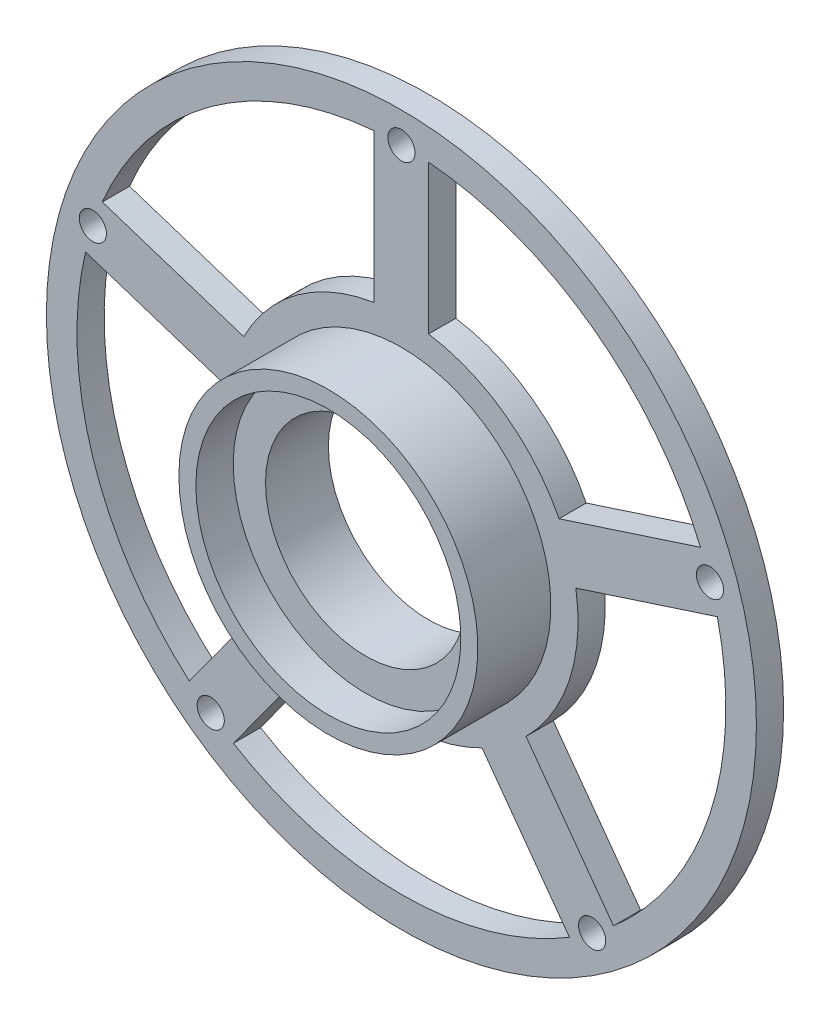
ISO-10303-21;
HEADER;
FILE_DESCRIPTION(('STEP AP214'),'2;1');
FILE_NAME('part.step','',(''),(''),'','','');
FILE_SCHEMA(('AUTOMOTIVE_DESIGN { 1 0 10303 214 1 1 1 1 }'));
ENDSEC;
DATA;
#1=APPLICATION_CONTEXT('core data for automotive mechanical design processes');
#2=APPLICATION_PROTOCOL_DEFINITION('international standard','automotive_design',2000,#1);
#3=PRODUCT_CONTEXT('',#1,'mechanical');
#4=PRODUCT('Part','Part','',(#3));
#5=PRODUCT_RELATED_PRODUCT_CATEGORY('part','',(#4));
#6=PRODUCT_DEFINITION_FORMATION('','',#4);
#7=PRODUCT_DEFINITION_CONTEXT('part definition',#1,'design');
#8=PRODUCT_DEFINITION('design','',#6,#7);
#9=PRODUCT_DEFINITION_SHAPE('','',#8);
#10=(LENGTH_UNIT() NAMED_UNIT(*) SI_UNIT(.MILLI.,.METRE.));
#11=(NAMED_UNIT(*) PLANE_ANGLE_UNIT() SI_UNIT($,.RADIAN.));
#12=(NAMED_UNIT(*) SI_UNIT($,.STERADIAN.) SOLID_ANGLE_UNIT());
#13=UNCERTAINTY_MEASURE_WITH_UNIT(LENGTH_MEASURE(1.E-05),#10,'distance_accuracy_value','');
#14=(GEOMETRIC_REPRESENTATION_CONTEXT(3) GLOBAL_UNCERTAINTY_ASSIGNED_CONTEXT((#13)) GLOBAL_UNIT_ASSIGNED_CONTEXT((#10,
#11,#12)) REPRESENTATION_CONTEXT('',''));
#15=CARTESIAN_POINT('',(0.,0.,0.));
#16=DIRECTION('',(0.,0.,1.));
#17=DIRECTION('',(1.,0.,0.));
#18=AXIS2_PLACEMENT_3D('',#15,#16,#17);
#19=CARTESIAN_POINT('',(0.,53.086,0.));
#20=DIRECTION('',(0.,0.,-1.));
#21=DIRECTION('',(-1.,0.,0.));
#22=AXIS2_PLACEMENT_3D('',#19,#20,#21);
#23=PLANE('',#22);
#24=CARTESIAN_POINT('',(0.,0.,0.));
#25=DIRECTION('',(0.,0.,-1.));
#26=DIRECTION('',(-0.809016994374942,0.58778525229248,0.));
#27=AXIS2_PLACEMENT_3D('',#24,#25,#26);
#28=CIRCLE('',#27,26.416);
#29=CARTESIAN_POINT('',(-18.6299292338565,-18.7278080068517,0.));
#30=VERTEX_POINT('',#29);
#31=CARTESIAN_POINT('',(-26.0798587083848,4.20071729002131,0.));
#32=VERTEX_POINT('',#31);
#33=EDGE_CURVE('E229',#30,#32,#28,.T.);
#34=ORIENTED_EDGE('',*,*,#33,.T.);
#35=DIRECTION('',(-0.951056516295152,0.309016994374951,0.));
#36=VECTOR('',#35,1.);
#37=CARTESIAN_POINT('',(-26.0798587083848,4.20071729002131,0.));
#38=LINE('',#37,#36);
#39=CARTESIAN_POINT('',(-47.2332271476346,11.0738633376052,0.));
#40=VERTEX_POINT('',#39);
#41=EDGE_CURVE('E232',#32,#40,#38,.T.);
#42=ORIENTED_EDGE('',*,*,#41,.T.);
#43=CARTESIAN_POINT('',(0.,0.,0.));
#44=DIRECTION('',(0.,0.,1.));
#45=DIRECTION('',(-0.809016994374942,0.58778525229248,0.));
#46=AXIS2_PLACEMENT_3D('',#43,#44,#45);
#47=CIRCLE('',#46,48.514);
#48=CARTESIAN_POINT('',(-31.7034299058623,-36.7219379690679,0.));
#49=VERTEX_POINT('',#48);
#50=EDGE_CURVE('E53',#40,#49,#47,.T.);
#51=ORIENTED_EDGE('',*,*,#50,.T.);
#52=DIRECTION('',(0.58778525229248,0.809016994374942,0.));
#53=VECTOR('',#52,1.);
#54=CARTESIAN_POINT('',(-31.7034299058623,-36.7219379690679,0.));
#55=LINE('',#54,#53);
#56=EDGE_CURVE('E237',#49,#30,#55,.T.);
#57=ORIENTED_EDGE('',*,*,#56,.T.);
#58=EDGE_LOOP('',(#34,#42,#51,#57));
#59=FACE_BOUND('',#58,.T.);
#60=CARTESIAN_POINT('',(28.5158137297168,-39.2486504651064,0.));
#61=DIRECTION('',(0.,0.,1.));
#62=DIRECTION('',(-0.809016994374951,-0.587785252292469,0.));
#63=AXIS2_PLACEMENT_3D('',#60,#61,#62);
#64=CIRCLE('',#63,2.032);
#65=CARTESIAN_POINT('',(26.8718911971469,-40.4430300977647,0.));
#66=VERTEX_POINT('',#65);
#67=EDGE_CURVE('E221',#66,#66,#64,.T.);
#68=ORIENTED_EDGE('',*,*,#67,.T.);
#69=EDGE_LOOP('',(#68));
#70=FACE_BOUND('',#69,.T.);
#71=CARTESIAN_POINT('',(0.,0.,0.));
#72=DIRECTION('',(0.,0.,-1.));
#73=DIRECTION('',(-0.809016994374951,-0.587785252292469,0.));
#74=AXIS2_PLACEMENT_3D('',#71,#72,#73);
#75=CIRCLE('',#74,26.416);
#76=CARTESIAN_POINT('',(12.0542391035766,-23.5053265374852,0.));
#77=VERTEX_POINT('',#76);
#78=CARTESIAN_POINT('',(-12.0542391035768,-23.5053265374851,0.));
#79=VERTEX_POINT('',#78);
#80=EDGE_CURVE('E267',#77,#79,#75,.T.);
#81=ORIENTED_EDGE('',*,*,#80,.T.);
#82=DIRECTION('',(-0.587785252292474,-0.809016994374947,0.));
#83=VECTOR('',#82,1.);
#84=CARTESIAN_POINT('',(-12.0542391035768,-23.5053265374851,0.));
#85=LINE('',#84,#83);
#86=CARTESIAN_POINT('',(-25.1277397755825,-41.4994564997014,0.));
#87=VERTEX_POINT('',#86);
#88=EDGE_CURVE('E270',#79,#87,#85,.T.);
#89=ORIENTED_EDGE('',*,*,#88,.T.);
#90=CARTESIAN_POINT('',(0.,0.,0.));
#91=DIRECTION('',(0.,0.,1.));
#92=DIRECTION('',(-0.809016994374951,-0.587785252292469,0.));
#93=AXIS2_PLACEMENT_3D('',#90,#91,#92);
#94=CIRCLE('',#93,48.514);
#95=CARTESIAN_POINT('',(25.1277397755822,-41.4994564997016,0.));
#96=VERTEX_POINT('',#95);
#97=EDGE_CURVE('E61',#87,#96,#94,.T.);
#98=ORIENTED_EDGE('',*,*,#97,.T.);
#99=DIRECTION('',(-0.587785252292469,0.809016994374951,0.));
#100=VECTOR('',#99,1.);
#101=CARTESIAN_POINT('',(25.1277397755822,-41.4994564997016,0.));
#102=LINE('',#101,#100);
#103=EDGE_CURVE('E275',#96,#77,#102,.T.);
#104=ORIENTED_EDGE('',*,*,#103,.T.);
#105=EDGE_LOOP('',(#81,#89,#98,#104));
#106=FACE_BOUND('',#105,.T.);
#107=CARTESIAN_POINT('',(46.1395558315431,14.9916504651061,0.));
#108=DIRECTION('',(0.,0.,1.));
#109=DIRECTION('',(0.309016994374945,-0.951056516295155,0.));
#110=AXIS2_PLACEMENT_3D('',#107,#108,#109);
#111=CIRCLE('',#110,2.032);
#112=CARTESIAN_POINT('',(46.767478364113,13.0591036239943,0.));
#113=VERTEX_POINT('',#112);
#114=EDGE_CURVE('E259',#113,#113,#111,.T.);
#115=ORIENTED_EDGE('',*,*,#114,.T.);
#116=EDGE_LOOP('',(#115));
#117=FACE_BOUND('',#116,.T.);
#118=CARTESIAN_POINT('',(-46.1395558315429,14.9916504651067,0.));
#119=DIRECTION('',(0.,0.,1.));
#120=DIRECTION('',(0.309016994374958,0.95105651629515,0.));
#121=AXIS2_PLACEMENT_3D('',#118,#119,#120);
#122=CIRCLE('',#121,2.032);
#123=CARTESIAN_POINT('',(-45.511633298973,16.9241973062185,0.));
#124=VERTEX_POINT('',#123);
#125=EDGE_CURVE('E212',#124,#124,#122,.T.);
#126=ORIENTED_EDGE('',*,*,#125,.T.);
#127=EDGE_LOOP('',(#126));
#128=FACE_BOUND('',#127,.T.);
#129=CARTESIAN_POINT('',(0.,0.,0.));
#130=DIRECTION('',(0.,0.,-1.));
#131=DIRECTION('',(0.309016994374958,0.95105651629515,0.));
#132=AXIS2_PLACEMENT_3D('',#129,#130,#131);
#133=CIRCLE('',#132,26.416);
#134=CARTESIAN_POINT('',(-23.5681685781051,11.9309046544685,0.));
#135=VERTEX_POINT('',#134);
#136=CARTESIAN_POINT('',(-4.06399999999983,26.1015125998476,0.));
#137=VERTEX_POINT('',#136);
#138=EDGE_CURVE('E179',#135,#137,#133,.T.);
#139=ORIENTED_EDGE('',*,*,#138,.T.);
#140=DIRECTION('',(0.,1.,0.));
#141=VECTOR('',#140,1.);
#142=CARTESIAN_POINT('',(-4.06399999999983,26.1015125998476,0.));
#143=LINE('',#142,#141);
#144=CARTESIAN_POINT('',(-4.06399999999968,48.3434804291127,0.));
#145=VERTEX_POINT('',#144);
#146=EDGE_CURVE('E191',#137,#145,#143,.T.);
#147=ORIENTED_EDGE('',*,*,#146,.T.);
#148=CARTESIAN_POINT('',(0.,0.,0.));
#149=DIRECTION('',(0.,0.,1.));
#150=DIRECTION('',(0.309016994374958,0.95105651629515,0.));
#151=AXIS2_PLACEMENT_3D('',#148,#149,#150);
#152=CIRCLE('',#151,48.514);
#153=CARTESIAN_POINT('',(-44.7215370173548,18.8040507020525,0.));
#154=VERTEX_POINT('',#153);
#155=EDGE_CURVE('E195',#145,#154,#152,.T.);
#156=ORIENTED_EDGE('',*,*,#155,.T.);
#157=DIRECTION('',(0.95105651629515,-0.309016994374958,0.));
#158=VECTOR('',#157,1.);
#159=CARTESIAN_POINT('',(-44.7215370173548,18.8040507020525,0.));
#160=LINE('',#159,#158);
#161=EDGE_CURVE('E187',#154,#135,#160,.T.);
#162=ORIENTED_EDGE('',*,*,#161,.T.);
#163=EDGE_LOOP('',(#139,#147,#156,#162));
#164=FACE_BOUND('',#163,.T.);
#165=CARTESIAN_POINT('',(-28.5158137297174,-39.248650465106,0.));
#166=DIRECTION('',(0.,0.,1.));
#167=DIRECTION('',(-0.809016994374942,0.58778525229248,0.));
#168=AXIS2_PLACEMENT_3D('',#165,#166,#167);
#169=CIRCLE('',#168,2.032);
#170=CARTESIAN_POINT('',(-30.1597362622873,-38.0542708324476,0.));
#171=VERTEX_POINT('',#170);
#172=EDGE_CURVE('E244',#171,#171,#169,.T.);
#173=ORIENTED_EDGE('',*,*,#172,.T.);
#174=EDGE_LOOP('',(#173));
#175=FACE_BOUND('',#174,.T.);
#176=CARTESIAN_POINT('',(0.,0.,0.));
#177=DIRECTION('',(0.,0.,-1.));
#178=DIRECTION('',(0.309016994374945,-0.951056516295155,0.));
#179=AXIS2_PLACEMENT_3D('',#176,#177,#178);
#180=CIRCLE('',#179,26.416);
#181=CARTESIAN_POINT('',(26.0798587083849,4.20071729002113,0.));
#182=VERTEX_POINT('',#181);
#183=CARTESIAN_POINT('',(18.6299292338564,-18.7278080068518,0.));
#184=VERTEX_POINT('',#183);
#185=EDGE_CURVE('E295',#182,#184,#180,.T.);
#186=ORIENTED_EDGE('',*,*,#185,.T.);
#187=DIRECTION('',(0.587785252292475,-0.809016994374946,0.));
#188=VECTOR('',#187,1.);
#189=CARTESIAN_POINT('',(18.6299292338564,-18.7278080068518,0.));
#190=LINE('',#189,#188);
#191=CARTESIAN_POINT('',(31.7034299058621,-36.7219379690682,0.));
#192=VERTEX_POINT('',#191);
#193=EDGE_CURVE('E298',#184,#192,#190,.T.);
#194=ORIENTED_EDGE('',*,*,#193,.T.);
#195=CARTESIAN_POINT('',(0.,0.,0.));
#196=DIRECTION('',(0.,0.,1.));
#197=DIRECTION('',(0.309016994374945,-0.951056516295155,0.));
#198=AXIS2_PLACEMENT_3D('',#195,#196,#197);
#199=CIRCLE('',#198,48.514);
#200=CARTESIAN_POINT('',(47.2332271476346,11.0738633376049,0.));
#201=VERTEX_POINT('',#200);
#202=EDGE_CURVE('E302',#192,#201,#199,.T.);
#203=ORIENTED_EDGE('',*,*,#202,.T.);
#204=DIRECTION('',(-0.951056516295155,-0.309016994374945,0.));
#205=VECTOR('',#204,1.);
#206=CARTESIAN_POINT('',(47.2332271476347,11.0738633376049,0.));
#207=LINE('',#206,#205);
#208=EDGE_CURVE('E305',#201,#182,#207,.T.);
#209=ORIENTED_EDGE('',*,*,#208,.T.);
#210=EDGE_LOOP('',(#186,#194,#203,#209));
#211=FACE_BOUND('',#210,.T.);
#212=CARTESIAN_POINT('',(0.,0.,0.));
#213=DIRECTION('',(0.,0.,-1.));
#214=DIRECTION('',(1.,0.,0.));
#215=AXIS2_PLACEMENT_3D('',#212,#213,#214);
#216=CIRCLE('',#215,26.416);
#217=CARTESIAN_POINT('',(4.064,26.1015125998475,0.));
#218=VERTEX_POINT('',#217);
#219=CARTESIAN_POINT('',(23.5681685781052,11.9309046544683,0.));
#220=VERTEX_POINT('',#219);
#221=EDGE_CURVE('E327',#218,#220,#216,.T.);
#222=ORIENTED_EDGE('',*,*,#221,.T.);
#223=DIRECTION('',(0.951056516295152,0.309016994374952,0.));
#224=VECTOR('',#223,1.);
#225=CARTESIAN_POINT('',(23.5681685781052,11.9309046544683,0.));
#226=LINE('',#225,#224);
#227=CARTESIAN_POINT('',(44.721537017355,18.8040507020522,0.));
#228=VERTEX_POINT('',#227);
#229=EDGE_CURVE('E330',#220,#228,#226,.T.);
#230=ORIENTED_EDGE('',*,*,#229,.T.);
#231=CARTESIAN_POINT('',(0.,0.,0.));
#232=DIRECTION('',(0.,0.,1.));
#233=DIRECTION('',(1.,0.,0.));
#234=AXIS2_PLACEMENT_3D('',#231,#232,#233);
#235=CIRCLE('',#234,48.514);
#236=CARTESIAN_POINT('',(4.064,48.3434804291127,0.));
#237=VERTEX_POINT('',#236);
#238=EDGE_CURVE('E334',#228,#237,#235,.T.);
#239=ORIENTED_EDGE('',*,*,#238,.T.);
#240=DIRECTION('',(0.,-1.,0.));
#241=VECTOR('',#240,1.);
#242=CARTESIAN_POINT('',(4.064,48.3434804291127,0.));
#243=LINE('',#242,#241);
#244=EDGE_CURVE('E337',#237,#218,#243,.T.);
#245=ORIENTED_EDGE('',*,*,#244,.T.);
#246=EDGE_LOOP('',(#222,#230,#239,#245));
#247=FACE_BOUND('',#246,.T.);
#248=CARTESIAN_POINT('',(0.,48.514,0.));
#249=DIRECTION('',(0.,0.,1.));
#250=DIRECTION('',(1.,0.,0.));
#251=AXIS2_PLACEMENT_3D('',#248,#249,#250);
#252=CIRCLE('',#251,2.032);
#253=CARTESIAN_POINT('',(2.032,48.514,0.));
#254=VERTEX_POINT('',#253);
#255=EDGE_CURVE('E320',#254,#254,#252,.T.);
#256=ORIENTED_EDGE('',*,*,#255,.T.);
#257=EDGE_LOOP('',(#256));
#258=FACE_BOUND('',#257,.T.);
#259=CARTESIAN_POINT('',(0.,0.,0.));
#260=DIRECTION('',(0.,0.,-1.));
#261=DIRECTION('',(-1.,0.,0.));
#262=AXIS2_PLACEMENT_3D('',#259,#260,#261);
#263=CIRCLE('',#262,53.086);
#264=CARTESIAN_POINT('',(-53.086,0.,0.));
#265=VERTEX_POINT('',#264);
#266=EDGE_CURVE('E354',#265,#265,#263,.T.);
#267=ORIENTED_EDGE('',*,*,#266,.T.);
#268=EDGE_LOOP('',(#267));
#269=FACE_BOUND('',#268,.T.);
#270=CARTESIAN_POINT('',(0.,0.,0.));
#271=DIRECTION('',(0.,0.,-1.));
#272=DIRECTION('',(-1.,0.,0.));
#273=AXIS2_PLACEMENT_3D('',#270,#271,#272);
#274=CIRCLE('',#273,14.986);
#275=CARTESIAN_POINT('',(-14.986,0.,0.));
#276=VERTEX_POINT('',#275);
#277=EDGE_CURVE('E11',#276,#276,#274,.T.);
#278=ORIENTED_EDGE('',*,*,#277,.F.);
#279=EDGE_LOOP('',(#278));
#280=FACE_BOUND('',#279,.T.);
#281=ADVANCED_FACE('F39',(#59,#70,#106,#117,#128,#164,#175,#211,#247,#258,#269,#280),#23,.T.);
#282=CARTESIAN_POINT('',(0.,0.,0.));
#283=DIRECTION('',(0.,0.,-1.));
#284=DIRECTION('',(-1.,0.,0.));
#285=AXIS2_PLACEMENT_3D('',#282,#283,#284);
#286=CYLINDRICAL_SURFACE('',#285,14.986);
#287=ORIENTED_EDGE('',*,*,#277,.T.);
#288=EDGE_LOOP('',(#287));
#289=FACE_BOUND('',#288,.T.);
#290=CARTESIAN_POINT('',(0.,0.,9.39799999999999));
#291=DIRECTION('',(0.,0.,-1.));
#292=DIRECTION('',(-1.,0.,0.));
#293=AXIS2_PLACEMENT_3D('',#290,#291,#292);
#294=CIRCLE('',#293,14.986);
#295=CARTESIAN_POINT('',(-14.986,0.,9.39799999999999));
#296=VERTEX_POINT('',#295);
#297=EDGE_CURVE('E46',#296,#296,#294,.T.);
#298=ORIENTED_EDGE('',*,*,#297,.F.);
#299=EDGE_LOOP('',(#298));
#300=FACE_BOUND('',#299,.T.);
#301=ADVANCED_FACE('F387',(#289,#300),#286,.F.);
#302=CARTESIAN_POINT('',(0.,14.986,9.39799999999999));
#303=DIRECTION('',(0.,0.,1.));
#304=DIRECTION('',(1.,0.,0.));
#305=AXIS2_PLACEMENT_3D('',#302,#303,#304);
#306=PLANE('',#305);
#307=ORIENTED_EDGE('',*,*,#297,.T.);
#308=EDGE_LOOP('',(#307));
#309=FACE_BOUND('',#308,.T.);
#310=CARTESIAN_POINT('',(0.,0.,9.39799999999999));
#311=DIRECTION('',(0.,0.,-1.));
#312=DIRECTION('',(-1.,0.,0.));
#313=AXIS2_PLACEMENT_3D('',#310,#311,#312);
#314=CIRCLE('',#313,19.812);
#315=CARTESIAN_POINT('',(-19.812,0.,9.39799999999999));
#316=VERTEX_POINT('',#315);
#317=EDGE_CURVE('E379',#316,#316,#314,.T.);
#318=ORIENTED_EDGE('',*,*,#317,.F.);
#319=EDGE_LOOP('',(#318));
#320=FACE_BOUND('',#319,.T.);
#321=ADVANCED_FACE('F384',(#309,#320),#306,.T.);
#322=CARTESIAN_POINT('',(0.,0.,0.));
#323=DIRECTION('',(0.,0.,-1.));
#324=DIRECTION('',(-1.,0.,0.));
#325=AXIS2_PLACEMENT_3D('',#322,#323,#324);
#326=CYLINDRICAL_SURFACE('',#325,19.812);
#327=ORIENTED_EDGE('',*,*,#317,.T.);
#328=EDGE_LOOP('',(#327));
#329=FACE_BOUND('',#328,.T.);
#330=CARTESIAN_POINT('',(0.,0.,14.986));
#331=DIRECTION('',(0.,0.,-1.));
#332=DIRECTION('',(-1.,0.,0.));
#333=AXIS2_PLACEMENT_3D('',#330,#331,#332);
#334=CIRCLE('',#333,19.812);
#335=CARTESIAN_POINT('',(-19.812,0.,14.986));
#336=VERTEX_POINT('',#335);
#337=EDGE_CURVE('E376',#336,#336,#334,.T.);
#338=ORIENTED_EDGE('',*,*,#337,.F.);
#339=EDGE_LOOP('',(#338));
#340=FACE_BOUND('',#339,.T.);
#341=ADVANCED_FACE('F393',(#329,#340),#326,.F.);
#342=CARTESIAN_POINT('',(0.,19.812,14.986));
#343=DIRECTION('',(0.,0.,1.));
#344=DIRECTION('',(1.,0.,0.));
#345=AXIS2_PLACEMENT_3D('',#342,#343,#344);
#346=PLANE('',#345);
#347=ORIENTED_EDGE('',*,*,#337,.T.);
#348=EDGE_LOOP('',(#347));
#349=FACE_BOUND('',#348,.T.);
#350=CARTESIAN_POINT('',(0.,0.,14.986));
#351=DIRECTION('',(0.,0.,-1.));
#352=DIRECTION('',(-1.,0.,0.));
#353=AXIS2_PLACEMENT_3D('',#350,#351,#352);
#354=CIRCLE('',#353,22.352);
#355=CARTESIAN_POINT('',(-22.352,0.,14.986));
#356=VERTEX_POINT('',#355);
#357=EDGE_CURVE('E373',#356,#356,#354,.T.);
#358=ORIENTED_EDGE('',*,*,#357,.F.);
#359=EDGE_LOOP('',(#358));
#360=FACE_BOUND('',#359,.T.);
#361=ADVANCED_FACE('F400',(#349,#360),#346,.T.);
#362=CARTESIAN_POINT('',(0.,0.,0.));
#363=DIRECTION('',(0.,0.,-1.));
#364=DIRECTION('',(-1.,0.,0.));
#365=AXIS2_PLACEMENT_3D('',#362,#363,#364);
#366=CYLINDRICAL_SURFACE('',#365,22.352);
#367=ORIENTED_EDGE('',*,*,#357,.T.);
#368=EDGE_LOOP('',(#367));
#369=FACE_BOUND('',#368,.T.);
#370=CARTESIAN_POINT('',(0.,0.,4.06400000000001));
#371=DIRECTION('',(0.,0.,-1.));
#372=DIRECTION('',(-1.,0.,0.));
#373=AXIS2_PLACEMENT_3D('',#370,#371,#372);
#374=CIRCLE('',#373,22.352);
#375=CARTESIAN_POINT('',(-22.352,0.,4.06400000000001));
#376=VERTEX_POINT('',#375);
#377=EDGE_CURVE('E370',#376,#376,#374,.T.);
#378=ORIENTED_EDGE('',*,*,#377,.F.);
#379=EDGE_LOOP('',(#378));
#380=FACE_BOUND('',#379,.T.);
#381=ADVANCED_FACE('F404',(#369,#380),#366,.T.);
#382=CARTESIAN_POINT('',(0.,22.352,4.06400000000001));
#383=DIRECTION('',(0.,0.,1.));
#384=DIRECTION('',(1.,0.,0.));
#385=AXIS2_PLACEMENT_3D('',#382,#383,#384);
#386=PLANE('',#385);
#387=CARTESIAN_POINT('',(0.,0.,4.06400000000001));
#388=DIRECTION('',(0.,0.,-1.));
#389=DIRECTION('',(-0.809016994374942,0.58778525229248,0.));
#390=AXIS2_PLACEMENT_3D('',#387,#388,#389);
#391=CIRCLE('',#390,26.416);
#392=CARTESIAN_POINT('',(-18.6299292338565,-18.7278080068517,4.06400000000001));
#393=VERTEX_POINT('',#392);
#394=CARTESIAN_POINT('',(-26.0798587083848,4.20071729002131,4.06400000000001));
#395=VERTEX_POINT('',#394);
#396=EDGE_CURVE('E241',#393,#395,#391,.T.);
#397=ORIENTED_EDGE('',*,*,#396,.F.);
#398=DIRECTION('',(0.58778525229248,0.809016994374942,0.));
#399=VECTOR('',#398,1.);
#400=CARTESIAN_POINT('',(-31.7034299058623,-36.7219379690679,4.06400000000001));
#401=LINE('',#400,#399);
#402=CARTESIAN_POINT('',(-31.7034299058623,-36.7219379690679,4.06400000000001));
#403=VERTEX_POINT('',#402);
#404=EDGE_CURVE('E233',#403,#393,#401,.T.);
#405=ORIENTED_EDGE('',*,*,#404,.F.);
#406=CARTESIAN_POINT('',(0.,0.,4.06400000000001));
#407=DIRECTION('',(0.,0.,1.));
#408=DIRECTION('',(-0.809016994374942,0.58778525229248,0.));
#409=AXIS2_PLACEMENT_3D('',#406,#407,#408);
#410=CIRCLE('',#409,48.514);
#411=CARTESIAN_POINT('',(-47.2332271476346,11.0738633376052,4.06400000000001));
#412=VERTEX_POINT('',#411);
#413=EDGE_CURVE('E247',#412,#403,#410,.T.);
#414=ORIENTED_EDGE('',*,*,#413,.F.);
#415=DIRECTION('',(-0.951056516295152,0.309016994374951,0.));
#416=VECTOR('',#415,1.);
#417=CARTESIAN_POINT('',(-26.0798587083848,4.20071729002131,4.06400000000001));
#418=LINE('',#417,#416);
#419=EDGE_CURVE('E243',#395,#412,#418,.T.);
#420=ORIENTED_EDGE('',*,*,#419,.F.);
#421=EDGE_LOOP('',(#397,#405,#414,#420));
#422=FACE_BOUND('',#421,.T.);
#423=CARTESIAN_POINT('',(28.5158137297168,-39.2486504651064,4.06400000000001));
#424=DIRECTION('',(0.,0.,1.));
#425=DIRECTION('',(-0.809016994374951,-0.587785252292469,0.));
#426=AXIS2_PLACEMENT_3D('',#423,#424,#425);
#427=CIRCLE('',#426,2.032);
#428=CARTESIAN_POINT('',(26.8718911971469,-40.4430300977647,4.06400000000001));
#429=VERTEX_POINT('',#428);
#430=EDGE_CURVE('E225',#429,#429,#427,.T.);
#431=ORIENTED_EDGE('',*,*,#430,.F.);
#432=EDGE_LOOP('',(#431));
#433=FACE_BOUND('',#432,.T.);
#434=CARTESIAN_POINT('',(0.,0.,4.06400000000001));
#435=DIRECTION('',(0.,0.,-1.));
#436=DIRECTION('',(-0.809016994374951,-0.587785252292469,0.));
#437=AXIS2_PLACEMENT_3D('',#434,#435,#436);
#438=CIRCLE('',#437,26.416);
#439=CARTESIAN_POINT('',(12.0542391035766,-23.5053265374852,4.06400000000001));
#440=VERTEX_POINT('',#439);
#441=CARTESIAN_POINT('',(-12.0542391035768,-23.5053265374851,4.06400000000001));
#442=VERTEX_POINT('',#441);
#443=EDGE_CURVE('E224',#440,#442,#438,.T.);
#444=ORIENTED_EDGE('',*,*,#443,.F.);
#445=DIRECTION('',(-0.587785252292469,0.809016994374951,0.));
#446=VECTOR('',#445,1.);
#447=CARTESIAN_POINT('',(25.1277397755822,-41.4994564997016,4.06400000000001));
#448=LINE('',#447,#446);
#449=CARTESIAN_POINT('',(25.1277397755822,-41.4994564997016,4.06400000000001));
#450=VERTEX_POINT('',#449);
#451=EDGE_CURVE('E271',#450,#440,#448,.T.);
#452=ORIENTED_EDGE('',*,*,#451,.F.);
#453=CARTESIAN_POINT('',(0.,0.,4.06400000000001));
#454=DIRECTION('',(0.,0.,1.));
#455=DIRECTION('',(-0.809016994374951,-0.587785252292469,0.));
#456=AXIS2_PLACEMENT_3D('',#453,#454,#455);
#457=CIRCLE('',#456,48.514);
#458=CARTESIAN_POINT('',(-25.1277397755825,-41.4994564997014,4.06400000000001));
#459=VERTEX_POINT('',#458);
#460=EDGE_CURVE('E283',#459,#450,#457,.T.);
#461=ORIENTED_EDGE('',*,*,#460,.F.);
#462=DIRECTION('',(-0.587785252292474,-0.809016994374947,0.));
#463=VECTOR('',#462,1.);
#464=CARTESIAN_POINT('',(-12.0542391035768,-23.5053265374851,4.06400000000001));
#465=LINE('',#464,#463);
#466=EDGE_CURVE('E280',#442,#459,#465,.T.);
#467=ORIENTED_EDGE('',*,*,#466,.F.);
#468=EDGE_LOOP('',(#444,#452,#461,#467));
#469=FACE_BOUND('',#468,.T.);
#470=CARTESIAN_POINT('',(46.1395558315431,14.9916504651061,4.06400000000001));
#471=DIRECTION('',(0.,0.,1.));
#472=DIRECTION('',(0.309016994374945,-0.951056516295155,0.));
#473=AXIS2_PLACEMENT_3D('',#470,#471,#472);
#474=CIRCLE('',#473,2.032);
#475=CARTESIAN_POINT('',(46.767478364113,13.0591036239943,4.06400000000001));
#476=VERTEX_POINT('',#475);
#477=EDGE_CURVE('E263',#476,#476,#474,.T.);
#478=ORIENTED_EDGE('',*,*,#477,.F.);
#479=EDGE_LOOP('',(#478));
#480=FACE_BOUND('',#479,.T.);
#481=CARTESIAN_POINT('',(-46.1395558315429,14.9916504651067,4.06400000000001));
#482=DIRECTION('',(0.,0.,1.));
#483=DIRECTION('',(0.309016994374958,0.95105651629515,0.));
#484=AXIS2_PLACEMENT_3D('',#481,#482,#483);
#485=CIRCLE('',#484,2.032);
#486=CARTESIAN_POINT('',(-45.511633298973,16.9241973062185,4.06400000000001));
#487=VERTEX_POINT('',#486);
#488=EDGE_CURVE('E517',#487,#487,#485,.T.);
#489=ORIENTED_EDGE('',*,*,#488,.F.);
#490=EDGE_LOOP('',(#489));
#491=FACE_BOUND('',#490,.T.);
#492=CARTESIAN_POINT('',(0.,0.,4.06400000000001));
#493=DIRECTION('',(0.,0.,-1.));
#494=DIRECTION('',(0.309016994374958,0.95105651629515,0.));
#495=AXIS2_PLACEMENT_3D('',#492,#493,#494);
#496=CIRCLE('',#495,26.416);
#497=CARTESIAN_POINT('',(-23.5681685781051,11.9309046544685,4.06400000000001));
#498=VERTEX_POINT('',#497);
#499=CARTESIAN_POINT('',(-4.06399999999983,26.1015125998476,4.06400000000001));
#500=VERTEX_POINT('',#499);
#501=EDGE_CURVE('E182',#498,#500,#496,.T.);
#502=ORIENTED_EDGE('',*,*,#501,.F.);
#503=DIRECTION('',(0.95105651629515,-0.309016994374958,0.));
#504=VECTOR('',#503,1.);
#505=CARTESIAN_POINT('',(-44.7215370173548,18.8040507020525,4.06400000000001));
#506=LINE('',#505,#504);
#507=CARTESIAN_POINT('',(-44.7215370173548,18.8040507020525,4.06400000000001));
#508=VERTEX_POINT('',#507);
#509=EDGE_CURVE('E199',#508,#498,#506,.T.);
#510=ORIENTED_EDGE('',*,*,#509,.F.);
#511=CARTESIAN_POINT('',(0.,0.,4.06400000000001));
#512=DIRECTION('',(0.,0.,1.));
#513=DIRECTION('',(0.309016994374958,0.95105651629515,0.));
#514=AXIS2_PLACEMENT_3D('',#511,#512,#513);
#515=CIRCLE('',#514,48.514);
#516=CARTESIAN_POINT('',(-4.06399999999968,48.3434804291127,4.06400000000001));
#517=VERTEX_POINT('',#516);
#518=EDGE_CURVE('E202',#517,#508,#515,.T.);
#519=ORIENTED_EDGE('',*,*,#518,.F.);
#520=DIRECTION('',(0.,1.,0.));
#521=VECTOR('',#520,1.);
#522=CARTESIAN_POINT('',(-4.06399999999983,26.1015125998476,4.06400000000001));
#523=LINE('',#522,#521);
#524=EDGE_CURVE('E211',#500,#517,#523,.T.);
#525=ORIENTED_EDGE('',*,*,#524,.F.);
#526=EDGE_LOOP('',(#502,#510,#519,#525));
#527=FACE_BOUND('',#526,.T.);
#528=CARTESIAN_POINT('',(-28.5158137297174,-39.248650465106,4.06400000000001));
#529=DIRECTION('',(0.,0.,1.));
#530=DIRECTION('',(-0.809016994374942,0.58778525229248,0.));
#531=AXIS2_PLACEMENT_3D('',#528,#529,#530);
#532=CIRCLE('',#531,2.032);
#533=CARTESIAN_POINT('',(-30.1597362622873,-38.0542708324476,4.06400000000001));
#534=VERTEX_POINT('',#533);
#535=EDGE_CURVE('E205',#534,#534,#532,.T.);
#536=ORIENTED_EDGE('',*,*,#535,.F.);
#537=EDGE_LOOP('',(#536));
#538=FACE_BOUND('',#537,.T.);
#539=CARTESIAN_POINT('',(0.,0.,4.06400000000001));
#540=DIRECTION('',(0.,0.,-1.));
#541=DIRECTION('',(0.309016994374945,-0.951056516295155,0.));
#542=AXIS2_PLACEMENT_3D('',#539,#540,#541);
#543=CIRCLE('',#542,26.416);
#544=CARTESIAN_POINT('',(26.0798587083849,4.20071729002113,4.06400000000001));
#545=VERTEX_POINT('',#544);
#546=CARTESIAN_POINT('',(18.6299292338564,-18.7278080068518,4.06400000000001));
#547=VERTEX_POINT('',#546);
#548=EDGE_CURVE('E262',#545,#547,#543,.T.);
#549=ORIENTED_EDGE('',*,*,#548,.F.);
#550=DIRECTION('',(-0.951056516295155,-0.309016994374945,0.));
#551=VECTOR('',#550,1.);
#552=CARTESIAN_POINT('',(47.2332271476347,11.0738633376049,4.06400000000001));
#553=LINE('',#552,#551);
#554=CARTESIAN_POINT('',(47.2332271476346,11.0738633376049,4.06400000000001));
#555=VERTEX_POINT('',#554);
#556=EDGE_CURVE('E299',#555,#545,#553,.T.);
#557=ORIENTED_EDGE('',*,*,#556,.F.);
#558=CARTESIAN_POINT('',(0.,0.,4.06400000000001));
#559=DIRECTION('',(0.,0.,1.));
#560=DIRECTION('',(0.309016994374945,-0.951056516295155,0.));
#561=AXIS2_PLACEMENT_3D('',#558,#559,#560);
#562=CIRCLE('',#561,48.514);
#563=CARTESIAN_POINT('',(31.7034299058621,-36.7219379690682,4.06400000000001));
#564=VERTEX_POINT('',#563);
#565=EDGE_CURVE('E313',#564,#555,#562,.T.);
#566=ORIENTED_EDGE('',*,*,#565,.F.);
#567=DIRECTION('',(0.587785252292475,-0.809016994374946,0.));
#568=VECTOR('',#567,1.);
#569=CARTESIAN_POINT('',(18.6299292338564,-18.7278080068518,4.06400000000001));
#570=LINE('',#569,#568);
#571=EDGE_CURVE('E310',#547,#564,#570,.T.);
#572=ORIENTED_EDGE('',*,*,#571,.F.);
#573=EDGE_LOOP('',(#549,#557,#566,#572));
#574=FACE_BOUND('',#573,.T.);
#575=CARTESIAN_POINT('',(0.,0.,4.06400000000001));
#576=DIRECTION('',(0.,0.,-1.));
#577=DIRECTION('',(1.,0.,0.));
#578=AXIS2_PLACEMENT_3D('',#575,#576,#577);
#579=CIRCLE('',#578,26.416);
#580=CARTESIAN_POINT('',(4.064,26.1015125998475,4.06400000000001));
#581=VERTEX_POINT('',#580);
#582=CARTESIAN_POINT('',(23.5681685781052,11.9309046544683,4.06400000000001));
#583=VERTEX_POINT('',#582);
#584=EDGE_CURVE('E341',#581,#583,#579,.T.);
#585=ORIENTED_EDGE('',*,*,#584,.F.);
#586=DIRECTION('',(0.,-1.,0.));
#587=VECTOR('',#586,1.);
#588=CARTESIAN_POINT('',(4.064,48.3434804291127,4.06400000000001));
#589=LINE('',#588,#587);
#590=CARTESIAN_POINT('',(4.064,48.3434804291127,4.06400000000001));
#591=VERTEX_POINT('',#590);
#592=EDGE_CURVE('E331',#591,#581,#589,.T.);
#593=ORIENTED_EDGE('',*,*,#592,.F.);
#594=CARTESIAN_POINT('',(0.,0.,4.06400000000001));
#595=DIRECTION('',(0.,0.,1.));
#596=DIRECTION('',(1.,0.,0.));
#597=AXIS2_PLACEMENT_3D('',#594,#595,#596);
#598=CIRCLE('',#597,48.514);
#599=CARTESIAN_POINT('',(44.7215370173549,18.8040507020522,4.06400000000001));
#600=VERTEX_POINT('',#599);
#601=EDGE_CURVE('E347',#600,#591,#598,.T.);
#602=ORIENTED_EDGE('',*,*,#601,.F.);
#603=DIRECTION('',(0.951056516295152,0.309016994374952,0.));
#604=VECTOR('',#603,1.);
#605=CARTESIAN_POINT('',(23.5681685781052,11.9309046544683,4.06400000000001));
#606=LINE('',#605,#604);
#607=EDGE_CURVE('E343',#583,#600,#606,.T.);
#608=ORIENTED_EDGE('',*,*,#607,.F.);
#609=EDGE_LOOP('',(#585,#593,#602,#608));
#610=FACE_BOUND('',#609,.T.);
#611=CARTESIAN_POINT('',(0.,48.514,4.06400000000001));
#612=DIRECTION('',(0.,0.,1.));
#613=DIRECTION('',(1.,0.,0.));
#614=AXIS2_PLACEMENT_3D('',#611,#612,#613);
#615=CIRCLE('',#614,2.032);
#616=CARTESIAN_POINT('',(2.032,48.514,4.06400000000001));
#617=VERTEX_POINT('',#616);
#618=EDGE_CURVE('E344',#617,#617,#615,.T.);
#619=ORIENTED_EDGE('',*,*,#618,.F.);
#620=EDGE_LOOP('',(#619));
#621=FACE_BOUND('',#620,.T.);
#622=ORIENTED_EDGE('',*,*,#377,.T.);
#623=EDGE_LOOP('',(#622));
#624=FACE_BOUND('',#623,.T.);
#625=CARTESIAN_POINT('',(0.,0.,4.06400000000002));
#626=DIRECTION('',(0.,0.,-1.));
#627=DIRECTION('',(-1.,0.,0.));
#628=AXIS2_PLACEMENT_3D('',#625,#626,#627);
#629=CIRCLE('',#628,53.086);
#630=CARTESIAN_POINT('',(-53.086,0.,4.06400000000002));
#631=VERTEX_POINT('',#630);
#632=EDGE_CURVE('E367',#631,#631,#629,.T.);
#633=ORIENTED_EDGE('',*,*,#632,.F.);
#634=EDGE_LOOP('',(#633));
#635=FACE_BOUND('',#634,.T.);
#636=ADVANCED_FACE('F408',(#422,#433,#469,#480,#491,#527,#538,#574,#610,#621,#624,#635),#386,.T.);
#637=CARTESIAN_POINT('',(0.,0.,0.));
#638=DIRECTION('',(0.,0.,-1.));
#639=DIRECTION('',(-1.,0.,0.));
#640=AXIS2_PLACEMENT_3D('',#637,#638,#639);
#641=CYLINDRICAL_SURFACE('',#640,53.086);
#642=ORIENTED_EDGE('',*,*,#632,.T.);
#643=EDGE_LOOP('',(#642));
#644=FACE_BOUND('',#643,.T.);
#645=ORIENTED_EDGE('',*,*,#266,.F.);
#646=EDGE_LOOP('',(#645));
#647=FACE_BOUND('',#646,.T.);
#648=ADVANCED_FACE('F412',(#644,#647),#641,.T.);
#649=CARTESIAN_POINT('',(0.,48.514,0.));
#650=DIRECTION('',(0.,0.,1.));
#651=DIRECTION('',(1.,0.,0.));
#652=AXIS2_PLACEMENT_3D('',#649,#650,#651);
#653=CYLINDRICAL_SURFACE('',#652,2.032);
#654=ORIENTED_EDGE('',*,*,#255,.F.);
#655=EDGE_LOOP('',(#654));
#656=FACE_BOUND('',#655,.T.);
#657=ORIENTED_EDGE('',*,*,#618,.T.);
#658=EDGE_LOOP('',(#657));
#659=FACE_BOUND('',#658,.T.);
#660=ADVANCED_FACE('F416',(#656,#659),#653,.F.);
#661=CARTESIAN_POINT('',(0.,0.,0.));
#662=DIRECTION('',(0.,0.,1.));
#663=DIRECTION('',(1.,0.,0.));
#664=AXIS2_PLACEMENT_3D('',#661,#662,#663);
#665=CYLINDRICAL_SURFACE('',#664,26.416);
#666=ORIENTED_EDGE('',*,*,#584,.T.);
#667=DIRECTION('',(0.,0.,1.));
#668=VECTOR('',#667,1.);
#669=CARTESIAN_POINT('',(23.5681685781052,11.9309046544683,0.));
#670=LINE('',#669,#668);
#671=EDGE_CURVE('E340',#220,#583,#670,.T.);
#672=ORIENTED_EDGE('',*,*,#671,.F.);
#673=ORIENTED_EDGE('',*,*,#221,.F.);
#674=DIRECTION('',(0.,0.,1.));
#675=VECTOR('',#674,1.);
#676=CARTESIAN_POINT('',(4.064,26.1015125998475,0.));
#677=LINE('',#676,#675);
#678=EDGE_CURVE('E352',#218,#581,#677,.T.);
#679=ORIENTED_EDGE('',*,*,#678,.T.);
#680=EDGE_LOOP('',(#666,#672,#673,#679));
#681=FACE_BOUND('',#680,.T.);
#682=ADVANCED_FACE('F420',(#681),#665,.T.);
#683=CARTESIAN_POINT('',(4.064,48.3434804291127,0.));
#684=DIRECTION('',(-1.,0.,0.));
#685=DIRECTION('',(0.,0.,1.));
#686=AXIS2_PLACEMENT_3D('',#683,#684,#685);
#687=PLANE('',#686);
#688=ORIENTED_EDGE('',*,*,#592,.T.);
#689=ORIENTED_EDGE('',*,*,#678,.F.);
#690=ORIENTED_EDGE('',*,*,#244,.F.);
#691=DIRECTION('',(0.,0.,1.));
#692=VECTOR('',#691,1.);
#693=CARTESIAN_POINT('',(4.064,48.3434804291127,0.));
#694=LINE('',#693,#692);
#695=EDGE_CURVE('E355',#237,#591,#694,.T.);
#696=ORIENTED_EDGE('',*,*,#695,.T.);
#697=EDGE_LOOP('',(#688,#689,#690,#696));
#698=FACE_BOUND('',#697,.T.);
#699=ADVANCED_FACE('F424',(#698),#687,.F.);
#700=CARTESIAN_POINT('',(0.,0.,0.));
#701=DIRECTION('',(0.,0.,1.));
#702=DIRECTION('',(1.,0.,0.));
#703=AXIS2_PLACEMENT_3D('',#700,#701,#702);
#704=CYLINDRICAL_SURFACE('',#703,48.514);
#705=ORIENTED_EDGE('',*,*,#601,.T.);
#706=ORIENTED_EDGE('',*,*,#695,.F.);
#707=ORIENTED_EDGE('',*,*,#238,.F.);
#708=DIRECTION('',(0.,0.,1.));
#709=VECTOR('',#708,1.);
#710=CARTESIAN_POINT('',(44.7215370173549,18.8040507020522,0.));
#711=LINE('',#710,#709);
#712=EDGE_CURVE('E357',#228,#600,#711,.T.);
#713=ORIENTED_EDGE('',*,*,#712,.T.);
#714=EDGE_LOOP('',(#705,#706,#707,#713));
#715=FACE_BOUND('',#714,.T.);
#716=ADVANCED_FACE('F430',(#715),#704,.F.);
#717=CARTESIAN_POINT('',(23.5681685781052,11.9309046544683,0.));
#718=DIRECTION('',(0.309016994374952,-0.951056516295152,0.));
#719=DIRECTION('',(0.951056516295152,0.309016994374952,0.));
#720=AXIS2_PLACEMENT_3D('',#717,#718,#719);
#721=PLANE('',#720);
#722=ORIENTED_EDGE('',*,*,#607,.T.);
#723=ORIENTED_EDGE('',*,*,#712,.F.);
#724=ORIENTED_EDGE('',*,*,#229,.F.);
#725=ORIENTED_EDGE('',*,*,#671,.T.);
#726=EDGE_LOOP('',(#722,#723,#724,#725));
#727=FACE_BOUND('',#726,.T.);
#728=ADVANCED_FACE('F426',(#727),#721,.F.);
#729=CARTESIAN_POINT('',(0.,0.,0.));
#730=DIRECTION('',(0.,0.,1.));
#731=DIRECTION('',(1.,0.,0.));
#732=AXIS2_PLACEMENT_3D('',#729,#730,#731);
#733=CYLINDRICAL_SURFACE('',#732,26.416);
#734=ORIENTED_EDGE('',*,*,#548,.T.);
#735=DIRECTION('',(0.,0.,1.));
#736=VECTOR('',#735,1.);
#737=CARTESIAN_POINT('',(18.6299292338564,-18.7278080068518,0.));
#738=LINE('',#737,#736);
#739=EDGE_CURVE('E308',#184,#547,#738,.T.);
#740=ORIENTED_EDGE('',*,*,#739,.F.);
#741=ORIENTED_EDGE('',*,*,#185,.F.);
#742=DIRECTION('',(0.,0.,1.));
#743=VECTOR('',#742,1.);
#744=CARTESIAN_POINT('',(26.0798587083849,4.20071729002113,0.));
#745=LINE('',#744,#743);
#746=EDGE_CURVE('E318',#182,#545,#745,.T.);
#747=ORIENTED_EDGE('',*,*,#746,.T.);
#748=EDGE_LOOP('',(#734,#740,#741,#747));
#749=FACE_BOUND('',#748,.T.);
#750=ADVANCED_FACE('F429',(#749),#733,.T.);
#751=CARTESIAN_POINT('',(47.2332271476347,11.0738633376049,0.));
#752=DIRECTION('',(-0.309016994374945,0.951056516295155,0.));
#753=DIRECTION('',(-0.951056516295155,-0.309016994374945,0.));
#754=AXIS2_PLACEMENT_3D('',#751,#752,#753);
#755=PLANE('',#754);
#756=ORIENTED_EDGE('',*,*,#556,.T.);
#757=ORIENTED_EDGE('',*,*,#746,.F.);
#758=ORIENTED_EDGE('',*,*,#208,.F.);
#759=DIRECTION('',(0.,0.,1.));
#760=VECTOR('',#759,1.);
#761=CARTESIAN_POINT('',(47.2332271476346,11.0738633376049,0.));
#762=LINE('',#761,#760);
#763=EDGE_CURVE('E321',#201,#555,#762,.T.);
#764=ORIENTED_EDGE('',*,*,#763,.T.);
#765=EDGE_LOOP('',(#756,#757,#758,#764));
#766=FACE_BOUND('',#765,.T.);
#767=ADVANCED_FACE('F440',(#766),#755,.F.);
#768=CARTESIAN_POINT('',(0.,0.,0.));
#769=DIRECTION('',(0.,0.,1.));
#770=DIRECTION('',(1.,0.,0.));
#771=AXIS2_PLACEMENT_3D('',#768,#769,#770);
#772=CYLINDRICAL_SURFACE('',#771,48.514);
#773=ORIENTED_EDGE('',*,*,#565,.T.);
#774=ORIENTED_EDGE('',*,*,#763,.F.);
#775=ORIENTED_EDGE('',*,*,#202,.F.);
#776=DIRECTION('',(0.,0.,1.));
#777=VECTOR('',#776,1.);
#778=CARTESIAN_POINT('',(31.7034299058621,-36.7219379690682,0.));
#779=LINE('',#778,#777);
#780=EDGE_CURVE('E323',#192,#564,#779,.T.);
#781=ORIENTED_EDGE('',*,*,#780,.T.);
#782=EDGE_LOOP('',(#773,#774,#775,#781));
#783=FACE_BOUND('',#782,.T.);
#784=ADVANCED_FACE('F446',(#783),#772,.F.);
#785=CARTESIAN_POINT('',(18.6299292338564,-18.7278080068518,0.));
#786=DIRECTION('',(-0.809016994374946,-0.587785252292475,0.));
#787=DIRECTION('',(0.587785252292475,-0.809016994374946,0.));
#788=AXIS2_PLACEMENT_3D('',#785,#786,#787);
#789=PLANE('',#788);
#790=ORIENTED_EDGE('',*,*,#571,.T.);
#791=ORIENTED_EDGE('',*,*,#780,.F.);
#792=ORIENTED_EDGE('',*,*,#193,.F.);
#793=ORIENTED_EDGE('',*,*,#739,.T.);
#794=EDGE_LOOP('',(#790,#791,#792,#793));
#795=FACE_BOUND('',#794,.T.);
#796=ADVANCED_FACE('F442',(#795),#789,.F.);
#797=CARTESIAN_POINT('',(-28.5158137297174,-39.248650465106,0.));
#798=DIRECTION('',(0.,0.,1.));
#799=DIRECTION('',(1.,0.,0.));
#800=AXIS2_PLACEMENT_3D('',#797,#798,#799);
#801=CYLINDRICAL_SURFACE('',#800,2.032);
#802=ORIENTED_EDGE('',*,*,#172,.F.);
#803=EDGE_LOOP('',(#802));
#804=FACE_BOUND('',#803,.T.);
#805=ORIENTED_EDGE('',*,*,#535,.T.);
#806=EDGE_LOOP('',(#805));
#807=FACE_BOUND('',#806,.T.);
#808=ADVANCED_FACE('F445',(#804,#807),#801,.F.);
#809=CARTESIAN_POINT('',(0.,0.,0.));
#810=DIRECTION('',(0.,0.,1.));
#811=DIRECTION('',(1.,0.,0.));
#812=AXIS2_PLACEMENT_3D('',#809,#810,#811);
#813=CYLINDRICAL_SURFACE('',#812,26.416);
#814=ORIENTED_EDGE('',*,*,#501,.T.);
#815=DIRECTION('',(0.,0.,1.));
#816=VECTOR('',#815,1.);
#817=CARTESIAN_POINT('',(-4.06399999999983,26.1015125998476,0.));
#818=LINE('',#817,#816);
#819=EDGE_CURVE('E175',#137,#500,#818,.T.);
#820=ORIENTED_EDGE('',*,*,#819,.F.);
#821=ORIENTED_EDGE('',*,*,#138,.F.);
#822=DIRECTION('',(0.,0.,1.));
#823=VECTOR('',#822,1.);
#824=CARTESIAN_POINT('',(-23.5681685781051,11.9309046544685,0.));
#825=LINE('',#824,#823);
#826=EDGE_CURVE('E216',#135,#498,#825,.T.);
#827=ORIENTED_EDGE('',*,*,#826,.T.);
#828=EDGE_LOOP('',(#814,#820,#821,#827));
#829=FACE_BOUND('',#828,.T.);
#830=ADVANCED_FACE('F177',(#829),#813,.T.);
#831=CARTESIAN_POINT('',(-44.7215370173548,18.8040507020525,0.));
#832=DIRECTION('',(-0.309016994374958,-0.95105651629515,0.));
#833=DIRECTION('',(0.95105651629515,-0.309016994374958,0.));
#834=AXIS2_PLACEMENT_3D('',#831,#832,#833);
#835=PLANE('',#834);
#836=ORIENTED_EDGE('',*,*,#509,.T.);
#837=ORIENTED_EDGE('',*,*,#826,.F.);
#838=ORIENTED_EDGE('',*,*,#161,.F.);
#839=DIRECTION('',(0.,0.,1.));
#840=VECTOR('',#839,1.);
#841=CARTESIAN_POINT('',(-44.7215370173548,18.8040507020525,0.));
#842=LINE('',#841,#840);
#843=EDGE_CURVE('E218',#154,#508,#842,.T.);
#844=ORIENTED_EDGE('',*,*,#843,.T.);
#845=EDGE_LOOP('',(#836,#837,#838,#844));
#846=FACE_BOUND('',#845,.T.);
#847=ADVANCED_FACE('F495',(#846),#835,.F.);
#848=CARTESIAN_POINT('',(0.,0.,0.));
#849=DIRECTION('',(0.,0.,1.));
#850=DIRECTION('',(1.,0.,0.));
#851=AXIS2_PLACEMENT_3D('',#848,#849,#850);
#852=CYLINDRICAL_SURFACE('',#851,48.514);
#853=ORIENTED_EDGE('',*,*,#518,.T.);
#854=ORIENTED_EDGE('',*,*,#843,.F.);
#855=ORIENTED_EDGE('',*,*,#155,.F.);
#856=DIRECTION('',(0.,0.,1.));
#857=VECTOR('',#856,1.);
#858=CARTESIAN_POINT('',(-4.06399999999968,48.3434804291127,0.));
#859=LINE('',#858,#857);
#860=EDGE_CURVE('E186',#145,#517,#859,.T.);
#861=ORIENTED_EDGE('',*,*,#860,.T.);
#862=EDGE_LOOP('',(#853,#854,#855,#861));
#863=FACE_BOUND('',#862,.T.);
#864=ADVANCED_FACE('F498',(#863),#852,.F.);
#865=CARTESIAN_POINT('',(-4.06399999999983,26.1015125998476,0.));
#866=DIRECTION('',(1.,0.,0.));
#867=DIRECTION('',(0.,1.,0.));
#868=AXIS2_PLACEMENT_3D('',#865,#866,#867);
#869=PLANE('',#868);
#870=ORIENTED_EDGE('',*,*,#524,.T.);
#871=ORIENTED_EDGE('',*,*,#860,.F.);
#872=ORIENTED_EDGE('',*,*,#146,.F.);
#873=ORIENTED_EDGE('',*,*,#819,.T.);
#874=EDGE_LOOP('',(#870,#871,#872,#873));
#875=FACE_BOUND('',#874,.T.);
#876=ADVANCED_FACE('F192',(#875),#869,.F.);
#877=CARTESIAN_POINT('',(-46.1395558315429,14.9916504651067,0.));
#878=DIRECTION('',(0.,0.,1.));
#879=DIRECTION('',(1.,0.,0.));
#880=AXIS2_PLACEMENT_3D('',#877,#878,#879);
#881=CYLINDRICAL_SURFACE('',#880,2.032);
#882=ORIENTED_EDGE('',*,*,#125,.F.);
#883=EDGE_LOOP('',(#882));
#884=FACE_BOUND('',#883,.T.);
#885=ORIENTED_EDGE('',*,*,#488,.T.);
#886=EDGE_LOOP('',(#885));
#887=FACE_BOUND('',#886,.T.);
#888=ADVANCED_FACE('F473',(#884,#887),#881,.F.);
#889=CARTESIAN_POINT('',(46.1395558315431,14.9916504651061,0.));
#890=DIRECTION('',(0.,0.,1.));
#891=DIRECTION('',(1.,0.,0.));
#892=AXIS2_PLACEMENT_3D('',#889,#890,#891);
#893=CYLINDRICAL_SURFACE('',#892,2.032);
#894=ORIENTED_EDGE('',*,*,#114,.F.);
#895=EDGE_LOOP('',(#894));
#896=FACE_BOUND('',#895,.T.);
#897=ORIENTED_EDGE('',*,*,#477,.T.);
#898=EDGE_LOOP('',(#897));
#899=FACE_BOUND('',#898,.T.);
#900=ADVANCED_FACE('F458',(#896,#899),#893,.F.);
#901=CARTESIAN_POINT('',(0.,0.,0.));
#902=DIRECTION('',(0.,0.,1.));
#903=DIRECTION('',(1.,0.,0.));
#904=AXIS2_PLACEMENT_3D('',#901,#902,#903);
#905=CYLINDRICAL_SURFACE('',#904,26.416);
#906=ORIENTED_EDGE('',*,*,#443,.T.);
#907=DIRECTION('',(0.,0.,1.));
#908=VECTOR('',#907,1.);
#909=CARTESIAN_POINT('',(-12.0542391035768,-23.5053265374851,0.));
#910=LINE('',#909,#908);
#911=EDGE_CURVE('E278',#79,#442,#910,.T.);
#912=ORIENTED_EDGE('',*,*,#911,.F.);
#913=ORIENTED_EDGE('',*,*,#80,.F.);
#914=DIRECTION('',(0.,0.,1.));
#915=VECTOR('',#914,1.);
#916=CARTESIAN_POINT('',(12.0542391035766,-23.5053265374852,0.));
#917=LINE('',#916,#915);
#918=EDGE_CURVE('E266',#77,#440,#917,.T.);
#919=ORIENTED_EDGE('',*,*,#918,.T.);
#920=EDGE_LOOP('',(#906,#912,#913,#919));
#921=FACE_BOUND('',#920,.T.);
#922=ADVANCED_FACE('F454',(#921),#905,.T.);
#923=CARTESIAN_POINT('',(25.1277397755822,-41.4994564997016,0.));
#924=DIRECTION('',(0.809016994374951,0.587785252292469,0.));
#925=DIRECTION('',(-0.587785252292469,0.809016994374951,0.));
#926=AXIS2_PLACEMENT_3D('',#923,#924,#925);
#927=PLANE('',#926);
#928=ORIENTED_EDGE('',*,*,#451,.T.);
#929=ORIENTED_EDGE('',*,*,#918,.F.);
#930=ORIENTED_EDGE('',*,*,#103,.F.);
#931=DIRECTION('',(0.,0.,1.));
#932=VECTOR('',#931,1.);
#933=CARTESIAN_POINT('',(25.1277397755822,-41.4994564997016,0.));
#934=LINE('',#933,#932);
#935=EDGE_CURVE('E289',#96,#450,#934,.T.);
#936=ORIENTED_EDGE('',*,*,#935,.T.);
#937=EDGE_LOOP('',(#928,#929,#930,#936));
#938=FACE_BOUND('',#937,.T.);
#939=ADVANCED_FACE('F457',(#938),#927,.F.);
#940=CARTESIAN_POINT('',(0.,0.,0.));
#941=DIRECTION('',(0.,0.,1.));
#942=DIRECTION('',(1.,0.,0.));
#943=AXIS2_PLACEMENT_3D('',#940,#941,#942);
#944=CYLINDRICAL_SURFACE('',#943,48.514);
#945=ORIENTED_EDGE('',*,*,#460,.T.);
#946=ORIENTED_EDGE('',*,*,#935,.F.);
#947=ORIENTED_EDGE('',*,*,#97,.F.);
#948=DIRECTION('',(0.,0.,1.));
#949=VECTOR('',#948,1.);
#950=CARTESIAN_POINT('',(-25.1277397755825,-41.4994564997014,0.));
#951=LINE('',#950,#949);
#952=EDGE_CURVE('E291',#87,#459,#951,.T.);
#953=ORIENTED_EDGE('',*,*,#952,.T.);
#954=EDGE_LOOP('',(#945,#946,#947,#953));
#955=FACE_BOUND('',#954,.T.);
#956=ADVANCED_FACE('F464',(#955),#944,.F.);
#957=CARTESIAN_POINT('',(-12.0542391035768,-23.5053265374851,0.));
#958=DIRECTION('',(-0.809016994374947,0.587785252292474,0.));
#959=DIRECTION('',(-0.587785252292474,-0.809016994374947,0.));
#960=AXIS2_PLACEMENT_3D('',#957,#958,#959);
#961=PLANE('',#960);
#962=ORIENTED_EDGE('',*,*,#466,.T.);
#963=ORIENTED_EDGE('',*,*,#952,.F.);
#964=ORIENTED_EDGE('',*,*,#88,.F.);
#965=ORIENTED_EDGE('',*,*,#911,.T.);
#966=EDGE_LOOP('',(#962,#963,#964,#965));
#967=FACE_BOUND('',#966,.T.);
#968=ADVANCED_FACE('F460',(#967),#961,.F.);
#969=CARTESIAN_POINT('',(28.5158137297168,-39.2486504651064,0.));
#970=DIRECTION('',(0.,0.,1.));
#971=DIRECTION('',(1.,0.,0.));
#972=AXIS2_PLACEMENT_3D('',#969,#970,#971);
#973=CYLINDRICAL_SURFACE('',#972,2.032);
#974=ORIENTED_EDGE('',*,*,#67,.F.);
#975=EDGE_LOOP('',(#974));
#976=FACE_BOUND('',#975,.T.);
#977=ORIENTED_EDGE('',*,*,#430,.T.);
#978=EDGE_LOOP('',(#977));
#979=FACE_BOUND('',#978,.T.);
#980=ADVANCED_FACE('F463',(#976,#979),#973,.F.);
#981=CARTESIAN_POINT('',(0.,0.,0.));
#982=DIRECTION('',(0.,0.,1.));
#983=DIRECTION('',(1.,0.,0.));
#984=AXIS2_PLACEMENT_3D('',#981,#982,#983);
#985=CYLINDRICAL_SURFACE('',#984,26.416);
#986=ORIENTED_EDGE('',*,*,#396,.T.);
#987=DIRECTION('',(0.,0.,1.));
#988=VECTOR('',#987,1.);
#989=CARTESIAN_POINT('',(-26.0798587083848,4.20071729002131,0.));
#990=LINE('',#989,#988);
#991=EDGE_CURVE('E240',#32,#395,#990,.T.);
#992=ORIENTED_EDGE('',*,*,#991,.F.);
#993=ORIENTED_EDGE('',*,*,#33,.F.);
#994=DIRECTION('',(0.,0.,1.));
#995=VECTOR('',#994,1.);
#996=CARTESIAN_POINT('',(-18.6299292338565,-18.7278080068517,0.));
#997=LINE('',#996,#995);
#998=EDGE_CURVE('E228',#30,#393,#997,.T.);
#999=ORIENTED_EDGE('',*,*,#998,.T.);
#1000=EDGE_LOOP('',(#986,#992,#993,#999));
#1001=FACE_BOUND('',#1000,.T.);
#1002=ADVANCED_FACE('F475',(#1001),#985,.T.);
#1003=CARTESIAN_POINT('',(-31.7034299058623,-36.7219379690679,0.));
#1004=DIRECTION('',(0.809016994374942,-0.58778525229248,0.));
#1005=DIRECTION('',(0.58778525229248,0.809016994374942,0.));
#1006=AXIS2_PLACEMENT_3D('',#1003,#1004,#1005);
#1007=PLANE('',#1006);
#1008=ORIENTED_EDGE('',*,*,#404,.T.);
#1009=ORIENTED_EDGE('',*,*,#998,.F.);
#1010=ORIENTED_EDGE('',*,*,#56,.F.);
#1011=DIRECTION('',(0.,0.,1.));
#1012=VECTOR('',#1011,1.);
#1013=CARTESIAN_POINT('',(-31.7034299058623,-36.7219379690679,0.));
#1014=LINE('',#1013,#1012);
#1015=EDGE_CURVE('E253',#49,#403,#1014,.T.);
#1016=ORIENTED_EDGE('',*,*,#1015,.T.);
#1017=EDGE_LOOP('',(#1008,#1009,#1010,#1016));
#1018=FACE_BOUND('',#1017,.T.);
#1019=ADVANCED_FACE('F478',(#1018),#1007,.F.);
#1020=CARTESIAN_POINT('',(0.,0.,0.));
#1021=DIRECTION('',(0.,0.,1.));
#1022=DIRECTION('',(1.,0.,0.));
#1023=AXIS2_PLACEMENT_3D('',#1020,#1021,#1022);
#1024=CYLINDRICAL_SURFACE('',#1023,48.514);
#1025=ORIENTED_EDGE('',*,*,#413,.T.);
#1026=ORIENTED_EDGE('',*,*,#1015,.F.);
#1027=ORIENTED_EDGE('',*,*,#50,.F.);
#1028=DIRECTION('',(0.,0.,1.));
#1029=VECTOR('',#1028,1.);
#1030=CARTESIAN_POINT('',(-47.2332271476346,11.0738633376052,0.));
#1031=LINE('',#1030,#1029);
#1032=EDGE_CURVE('E255',#40,#412,#1031,.T.);
#1033=ORIENTED_EDGE('',*,*,#1032,.T.);
#1034=EDGE_LOOP('',(#1025,#1026,#1027,#1033));
#1035=FACE_BOUND('',#1034,.T.);
#1036=ADVANCED_FACE('F483',(#1035),#1024,.F.);
#1037=CARTESIAN_POINT('',(-26.0798587083848,4.20071729002131,0.));
#1038=DIRECTION('',(0.309016994374951,0.951056516295152,0.));
#1039=DIRECTION('',(-0.951056516295152,0.309016994374951,0.));
#1040=AXIS2_PLACEMENT_3D('',#1037,#1038,#1039);
#1041=PLANE('',#1040);
#1042=ORIENTED_EDGE('',*,*,#419,.T.);
#1043=ORIENTED_EDGE('',*,*,#1032,.F.);
#1044=ORIENTED_EDGE('',*,*,#41,.F.);
#1045=ORIENTED_EDGE('',*,*,#991,.T.);
#1046=EDGE_LOOP('',(#1042,#1043,#1044,#1045));
#1047=FACE_BOUND('',#1046,.T.);
#1048=ADVANCED_FACE('F480',(#1047),#1041,.F.);
#1049=CLOSED_SHELL('',(#281,#301,#321,#341,#361,#381,#636,#648,#660,#682,#699,#716,#728,#750,
#767,#784,#796,#808,#830,#847,#864,#876,#888,#900,#922,#939,#956,#968,#980,#1002,#1019,#1036,#1048));
#1050=MANIFOLD_SOLID_BREP('B2',#1049);
#1051=ADVANCED_BREP_SHAPE_REPRESENTATION('',(#18,#1050),#14);
#1052=SHAPE_DEFINITION_REPRESENTATION(#9,#1051);
ENDSEC;
END-ISO-10303-21;
